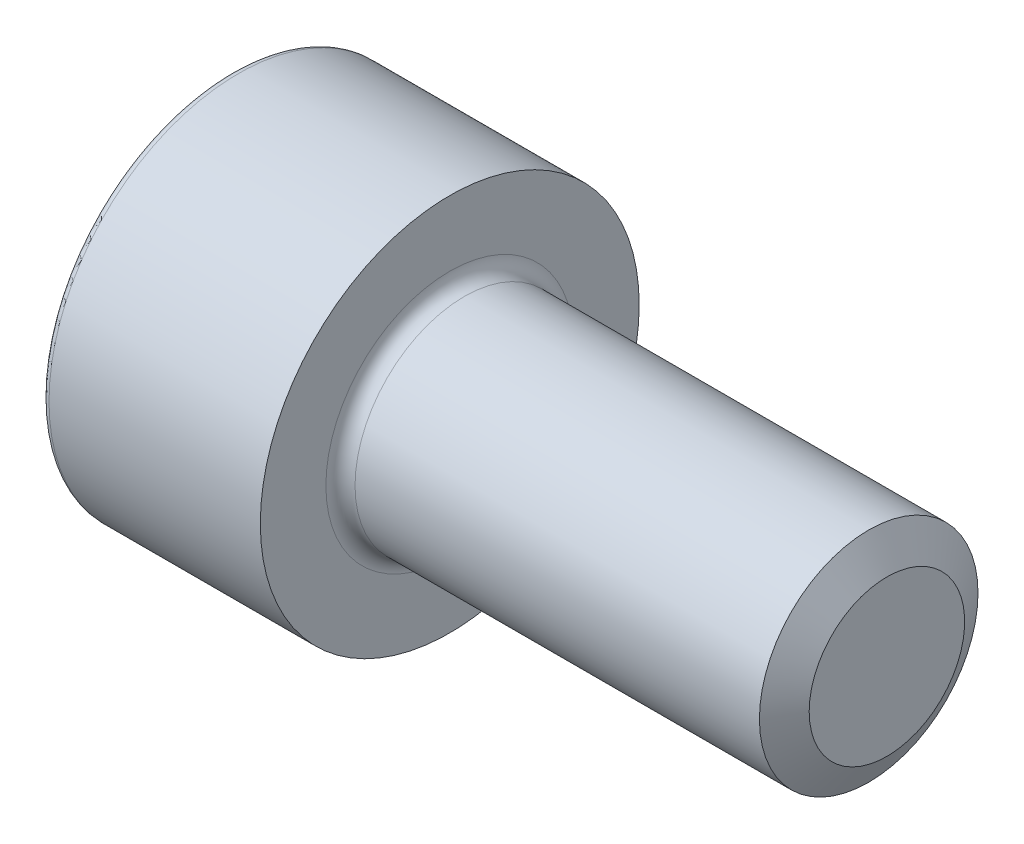
ISO-10303-21;
HEADER;
FILE_DESCRIPTION(('STEP AP214'),'2;1');
FILE_NAME('part.step','',(''),(''),'','','');
FILE_SCHEMA(('AUTOMOTIVE_DESIGN { 1 0 10303 214 1 1 1 1 }'));
ENDSEC;
DATA;
#1=APPLICATION_CONTEXT('core data for automotive mechanical design processes');
#2=APPLICATION_PROTOCOL_DEFINITION('international standard','automotive_design',2000,#1);
#3=PRODUCT_CONTEXT('',#1,'mechanical');
#4=PRODUCT('Part','Part','',(#3));
#5=PRODUCT_RELATED_PRODUCT_CATEGORY('part','',(#4));
#6=PRODUCT_DEFINITION_FORMATION('','',#4);
#7=PRODUCT_DEFINITION_CONTEXT('part definition',#1,'design');
#8=PRODUCT_DEFINITION('design','',#6,#7);
#9=PRODUCT_DEFINITION_SHAPE('','',#8);
#10=(LENGTH_UNIT() NAMED_UNIT(*) SI_UNIT(.MILLI.,.METRE.));
#11=(NAMED_UNIT(*) PLANE_ANGLE_UNIT() SI_UNIT($,.RADIAN.));
#12=(NAMED_UNIT(*) SI_UNIT($,.STERADIAN.) SOLID_ANGLE_UNIT());
#13=UNCERTAINTY_MEASURE_WITH_UNIT(LENGTH_MEASURE(1.E-05),#10,'distance_accuracy_value','');
#14=(GEOMETRIC_REPRESENTATION_CONTEXT(3) GLOBAL_UNCERTAINTY_ASSIGNED_CONTEXT((#13)) GLOBAL_UNIT_ASSIGNED_CONTEXT((#10,
#11,#12)) REPRESENTATION_CONTEXT('',''));
#15=CARTESIAN_POINT('',(0.,0.,0.));
#16=DIRECTION('',(0.,0.,1.));
#17=DIRECTION('',(1.,0.,0.));
#18=AXIS2_PLACEMENT_3D('',#15,#16,#17);
#19=CARTESIAN_POINT('',(0.,0.,0.));
#20=DIRECTION('',(-1.,0.,0.));
#21=DIRECTION('',(0.,0.,1.));
#22=AXIS2_PLACEMENT_3D('',#19,#20,#21);
#23=CYLINDRICAL_SURFACE('',#22,1.5);
#24=CARTESIAN_POINT('',(3.2,0.,0.));
#25=DIRECTION('',(-1.,0.,0.));
#26=DIRECTION('',(0.,0.,1.));
#27=AXIS2_PLACEMENT_3D('',#24,#25,#26);
#28=CIRCLE('',#27,1.5);
#29=CARTESIAN_POINT('',(3.2,0.,1.5));
#30=VERTEX_POINT('',#29);
#31=EDGE_CURVE('E158',#30,#30,#28,.T.);
#32=ORIENTED_EDGE('',*,*,#31,.F.);
#33=EDGE_LOOP('',(#32));
#34=FACE_BOUND('',#33,.T.);
#35=CARTESIAN_POINT('',(8.75000733344089,0.,0.));
#36=DIRECTION('',(-1.,0.,0.));
#37=DIRECTION('',(0.,0.,1.));
#38=AXIS2_PLACEMENT_3D('',#35,#36,#37);
#39=CIRCLE('',#38,1.5);
#40=CARTESIAN_POINT('',(8.75000733344089,0.,1.5));
#41=VERTEX_POINT('',#40);
#42=EDGE_CURVE('E295',#41,#41,#39,.T.);
#43=ORIENTED_EDGE('',*,*,#42,.T.);
#44=EDGE_LOOP('',(#43));
#45=FACE_BOUND('',#44,.T.);
#46=ADVANCED_FACE('F55',(#34,#45),#23,.T.);
#47=CARTESIAN_POINT('',(0.,0.,0.));
#48=DIRECTION('',(1.,0.,0.));
#49=DIRECTION('',(0.,0.,-1.));
#50=AXIS2_PLACEMENT_3D('',#47,#48,#49);
#51=PLANE('',#50);
#52=CARTESIAN_POINT('',(0.,0.,0.));
#53=DIRECTION('',(1.,0.,0.));
#54=DIRECTION('',(0.,0.,-1.));
#55=AXIS2_PLACEMENT_3D('',#52,#53,#54);
#56=CIRCLE('',#55,2.5);
#57=CARTESIAN_POINT('',(0.,0.,-2.5));
#58=VERTEX_POINT('',#57);
#59=EDGE_CURVE('E63',#58,#58,#56,.F.);
#60=ORIENTED_EDGE('',*,*,#59,.T.);
#61=EDGE_LOOP('',(#60));
#62=FACE_BOUND('',#61,.T.);
#63=DIRECTION('',(0.,0.866025403784439,-0.5));
#64=VECTOR('',#63,1.);
#65=CARTESIAN_POINT('',(0.,0.,1.435));
#66=LINE('',#65,#64);
#67=CARTESIAN_POINT('',(0.,0.,1.435));
#68=VERTEX_POINT('',#67);
#69=CARTESIAN_POINT('',(0.,1.24274645443067,0.717499999999999));
#70=VERTEX_POINT('',#69);
#71=EDGE_CURVE('E144',#68,#70,#66,.T.);
#72=ORIENTED_EDGE('',*,*,#71,.F.);
#73=DIRECTION('',(0.,0.866025403784439,0.5));
#74=VECTOR('',#73,1.);
#75=CARTESIAN_POINT('',(0.,-1.24274645443067,0.7175));
#76=LINE('',#75,#74);
#77=CARTESIAN_POINT('',(0.,-1.24274645443067,0.7175));
#78=VERTEX_POINT('',#77);
#79=EDGE_CURVE('E70',#78,#68,#76,.T.);
#80=ORIENTED_EDGE('',*,*,#79,.F.);
#81=DIRECTION('',(0.,0.,1.));
#82=VECTOR('',#81,1.);
#83=CARTESIAN_POINT('',(0.,-1.24274645443067,-0.7175));
#84=LINE('',#83,#82);
#85=CARTESIAN_POINT('',(0.,-1.24274645443067,-0.7175));
#86=VERTEX_POINT('',#85);
#87=EDGE_CURVE('E154',#86,#78,#84,.T.);
#88=ORIENTED_EDGE('',*,*,#87,.F.);
#89=DIRECTION('',(0.,-0.866025403784439,0.5));
#90=VECTOR('',#89,1.);
#91=CARTESIAN_POINT('',(0.,0.,-1.435));
#92=LINE('',#91,#90);
#93=CARTESIAN_POINT('',(0.,0.,-1.435));
#94=VERTEX_POINT('',#93);
#95=EDGE_CURVE('E152',#94,#86,#92,.T.);
#96=ORIENTED_EDGE('',*,*,#95,.F.);
#97=DIRECTION('',(0.,-0.866025403784439,-0.5));
#98=VECTOR('',#97,1.);
#99=CARTESIAN_POINT('',(0.,1.24274645443067,-0.7175));
#100=LINE('',#99,#98);
#101=CARTESIAN_POINT('',(0.,1.24274645443067,-0.7175));
#102=VERTEX_POINT('',#101);
#103=EDGE_CURVE('E118',#102,#94,#100,.T.);
#104=ORIENTED_EDGE('',*,*,#103,.F.);
#105=DIRECTION('',(0.,0.,-1.));
#106=VECTOR('',#105,1.);
#107=CARTESIAN_POINT('',(0.,1.24274645443067,0.717499999999999));
#108=LINE('',#107,#106);
#109=EDGE_CURVE('E148',#70,#102,#108,.T.);
#110=ORIENTED_EDGE('',*,*,#109,.F.);
#111=EDGE_LOOP('',(#72,#80,#88,#96,#104,#110));
#112=FACE_BOUND('',#111,.T.);
#113=ADVANCED_FACE('F175',(#62,#112),#51,.F.);
#114=CARTESIAN_POINT('',(0.,0.,0.));
#115=DIRECTION('',(-1.,0.,0.));
#116=DIRECTION('',(0.,0.,1.));
#117=AXIS2_PLACEMENT_3D('',#114,#115,#116);
#118=CYLINDRICAL_SURFACE('',#117,2.6);
#119=CARTESIAN_POINT('',(0.1,0.,0.));
#120=DIRECTION('',(1.,0.,0.));
#121=DIRECTION('',(0.,0.,-1.));
#122=AXIS2_PLACEMENT_3D('',#119,#120,#121);
#123=CIRCLE('',#122,2.6);
#124=CARTESIAN_POINT('',(0.1,0.,-2.6));
#125=VERTEX_POINT('',#124);
#126=EDGE_CURVE('E13',#125,#125,#123,.T.);
#127=ORIENTED_EDGE('',*,*,#126,.T.);
#128=EDGE_LOOP('',(#127));
#129=FACE_BOUND('',#128,.T.);
#130=CARTESIAN_POINT('',(3.,0.,0.));
#131=DIRECTION('',(-1.,0.,0.));
#132=DIRECTION('',(0.,0.,1.));
#133=AXIS2_PLACEMENT_3D('',#130,#131,#132);
#134=CIRCLE('',#133,2.6);
#135=CARTESIAN_POINT('',(3.,0.,2.6));
#136=VERTEX_POINT('',#135);
#137=EDGE_CURVE('E169',#136,#136,#134,.T.);
#138=ORIENTED_EDGE('',*,*,#137,.T.);
#139=EDGE_LOOP('',(#138));
#140=FACE_BOUND('',#139,.T.);
#141=ADVANCED_FACE('F194',(#129,#140),#118,.T.);
#142=CARTESIAN_POINT('',(3.,2.6,0.));
#143=DIRECTION('',(-1.,0.,0.));
#144=DIRECTION('',(0.,0.,1.));
#145=AXIS2_PLACEMENT_3D('',#142,#143,#144);
#146=PLANE('',#145);
#147=ORIENTED_EDGE('',*,*,#137,.F.);
#148=EDGE_LOOP('',(#147));
#149=FACE_BOUND('',#148,.T.);
#150=CARTESIAN_POINT('',(3.,0.,0.));
#151=DIRECTION('',(-1.,0.,0.));
#152=DIRECTION('',(0.,0.,1.));
#153=AXIS2_PLACEMENT_3D('',#150,#151,#152);
#154=CIRCLE('',#153,1.7);
#155=CARTESIAN_POINT('',(3.,0.,1.7));
#156=VERTEX_POINT('',#155);
#157=EDGE_CURVE('E166',#156,#156,#154,.T.);
#158=ORIENTED_EDGE('',*,*,#157,.T.);
#159=EDGE_LOOP('',(#158));
#160=FACE_BOUND('',#159,.T.);
#161=ADVANCED_FACE('F203',(#149,#160),#146,.F.);
#162=CARTESIAN_POINT('',(3.2,0.,0.));
#163=DIRECTION('',(-1.,0.,0.));
#164=DIRECTION('',(0.,0.,1.));
#165=AXIS2_PLACEMENT_3D('',#162,#163,#164);
#166=TOROIDAL_SURFACE('',#165,1.7,0.2);
#167=ORIENTED_EDGE('',*,*,#157,.F.);
#168=EDGE_LOOP('',(#167));
#169=FACE_BOUND('',#168,.T.);
#170=ORIENTED_EDGE('',*,*,#31,.T.);
#171=EDGE_LOOP('',(#170));
#172=FACE_BOUND('',#171,.T.);
#173=ADVANCED_FACE('F199',(#169,#172),#166,.F.);
#174=CARTESIAN_POINT('',(1.3,-1.24274645443067,0.7175));
#175=DIRECTION('',(0.,-0.5,0.866025403784439));
#176=DIRECTION('',(0.,-0.866025403784439,-0.5));
#177=AXIS2_PLACEMENT_3D('',#174,#175,#176);
#178=PLANE('',#177);
#179=ORIENTED_EDGE('',*,*,#79,.T.);
#180=DIRECTION('',(-1.,0.,0.));
#181=VECTOR('',#180,1.);
#182=CARTESIAN_POINT('',(1.3,0.,1.435));
#183=LINE('',#182,#181);
#184=CARTESIAN_POINT('',(1.3,0.,1.435));
#185=VERTEX_POINT('',#184);
#186=EDGE_CURVE('E100',#185,#68,#183,.T.);
#187=ORIENTED_EDGE('',*,*,#186,.F.);
#188=DIRECTION('',(0.,0.866025403784439,0.5));
#189=VECTOR('',#188,1.);
#190=CARTESIAN_POINT('',(1.3,-1.24274645443067,0.7175));
#191=LINE('',#190,#189);
#192=CARTESIAN_POINT('',(1.3,-1.24274645443067,0.7175));
#193=VERTEX_POINT('',#192);
#194=EDGE_CURVE('E156',#193,#185,#191,.T.);
#195=ORIENTED_EDGE('',*,*,#194,.F.);
#196=DIRECTION('',(-1.,0.,0.));
#197=VECTOR('',#196,1.);
#198=CARTESIAN_POINT('',(1.3,-1.24274645443067,0.7175));
#199=LINE('',#198,#197);
#200=EDGE_CURVE('E78',#193,#78,#199,.T.);
#201=ORIENTED_EDGE('',*,*,#200,.T.);
#202=EDGE_LOOP('',(#179,#187,#195,#201));
#203=FACE_BOUND('',#202,.T.);
#204=ADVANCED_FACE('F202',(#203),#178,.F.);
#205=CARTESIAN_POINT('',(1.3,-1.24274645443067,-0.7175));
#206=DIRECTION('',(0.,-1.,0.));
#207=DIRECTION('',(0.,0.,-1.));
#208=AXIS2_PLACEMENT_3D('',#205,#206,#207);
#209=PLANE('',#208);
#210=ORIENTED_EDGE('',*,*,#87,.T.);
#211=ORIENTED_EDGE('',*,*,#200,.F.);
#212=DIRECTION('',(0.,0.,1.));
#213=VECTOR('',#212,1.);
#214=CARTESIAN_POINT('',(1.3,-1.24274645443067,-0.7175));
#215=LINE('',#214,#213);
#216=CARTESIAN_POINT('',(1.3,-1.24274645443067,-0.7175));
#217=VERTEX_POINT('',#216);
#218=EDGE_CURVE('E130',#217,#193,#215,.T.);
#219=ORIENTED_EDGE('',*,*,#218,.F.);
#220=DIRECTION('',(-1.,0.,0.));
#221=VECTOR('',#220,1.);
#222=CARTESIAN_POINT('',(1.3,-1.24274645443067,-0.7175));
#223=LINE('',#222,#221);
#224=EDGE_CURVE('E122',#217,#86,#223,.T.);
#225=ORIENTED_EDGE('',*,*,#224,.T.);
#226=EDGE_LOOP('',(#210,#211,#219,#225));
#227=FACE_BOUND('',#226,.T.);
#228=ADVANCED_FACE('F233',(#227),#209,.F.);
#229=CARTESIAN_POINT('',(1.3,0.,-1.435));
#230=DIRECTION('',(0.,-0.5,-0.866025403784439));
#231=DIRECTION('',(0.,0.866025403784439,-0.5));
#232=AXIS2_PLACEMENT_3D('',#229,#230,#231);
#233=PLANE('',#232);
#234=ORIENTED_EDGE('',*,*,#95,.T.);
#235=ORIENTED_EDGE('',*,*,#224,.F.);
#236=DIRECTION('',(0.,-0.866025403784439,0.5));
#237=VECTOR('',#236,1.);
#238=CARTESIAN_POINT('',(1.3,0.,-1.435));
#239=LINE('',#238,#237);
#240=CARTESIAN_POINT('',(1.3,0.,-1.435));
#241=VERTEX_POINT('',#240);
#242=EDGE_CURVE('E126',#241,#217,#239,.T.);
#243=ORIENTED_EDGE('',*,*,#242,.F.);
#244=DIRECTION('',(-1.,0.,0.));
#245=VECTOR('',#244,1.);
#246=CARTESIAN_POINT('',(1.3,0.,-1.435));
#247=LINE('',#246,#245);
#248=EDGE_CURVE('E111',#241,#94,#247,.T.);
#249=ORIENTED_EDGE('',*,*,#248,.T.);
#250=EDGE_LOOP('',(#234,#235,#243,#249));
#251=FACE_BOUND('',#250,.T.);
#252=ADVANCED_FACE('F127',(#251),#233,.F.);
#253=CARTESIAN_POINT('',(1.3,1.24274645443067,-0.7175));
#254=DIRECTION('',(0.,0.5,-0.866025403784439));
#255=DIRECTION('',(0.,0.866025403784439,0.5));
#256=AXIS2_PLACEMENT_3D('',#253,#254,#255);
#257=PLANE('',#256);
#258=ORIENTED_EDGE('',*,*,#103,.T.);
#259=ORIENTED_EDGE('',*,*,#248,.F.);
#260=DIRECTION('',(0.,-0.866025403784439,-0.5));
#261=VECTOR('',#260,1.);
#262=CARTESIAN_POINT('',(1.3,1.24274645443067,-0.7175));
#263=LINE('',#262,#261);
#264=CARTESIAN_POINT('',(1.3,1.24274645443067,-0.7175));
#265=VERTEX_POINT('',#264);
#266=EDGE_CURVE('E115',#265,#241,#263,.T.);
#267=ORIENTED_EDGE('',*,*,#266,.F.);
#268=DIRECTION('',(-1.,0.,0.));
#269=VECTOR('',#268,1.);
#270=CARTESIAN_POINT('',(1.3,1.24274645443067,-0.7175));
#271=LINE('',#270,#269);
#272=EDGE_CURVE('E123',#265,#102,#271,.T.);
#273=ORIENTED_EDGE('',*,*,#272,.T.);
#274=EDGE_LOOP('',(#258,#259,#267,#273));
#275=FACE_BOUND('',#274,.T.);
#276=ADVANCED_FACE('F113',(#275),#257,.F.);
#277=CARTESIAN_POINT('',(1.3,1.24274645443067,0.717499999999999));
#278=DIRECTION('',(0.,1.,0.));
#279=DIRECTION('',(0.,0.,1.));
#280=AXIS2_PLACEMENT_3D('',#277,#278,#279);
#281=PLANE('',#280);
#282=ORIENTED_EDGE('',*,*,#109,.T.);
#283=ORIENTED_EDGE('',*,*,#272,.F.);
#284=DIRECTION('',(0.,0.,-1.));
#285=VECTOR('',#284,1.);
#286=CARTESIAN_POINT('',(1.3,1.24274645443067,0.717499999999999));
#287=LINE('',#286,#285);
#288=CARTESIAN_POINT('',(1.3,1.24274645443067,0.717499999999999));
#289=VERTEX_POINT('',#288);
#290=EDGE_CURVE('E136',#289,#265,#287,.T.);
#291=ORIENTED_EDGE('',*,*,#290,.F.);
#292=DIRECTION('',(-1.,0.,0.));
#293=VECTOR('',#292,1.);
#294=CARTESIAN_POINT('',(1.3,1.24274645443067,0.717499999999999));
#295=LINE('',#294,#293);
#296=EDGE_CURVE('E161',#289,#70,#295,.T.);
#297=ORIENTED_EDGE('',*,*,#296,.T.);
#298=EDGE_LOOP('',(#282,#283,#291,#297));
#299=FACE_BOUND('',#298,.T.);
#300=ADVANCED_FACE('F251',(#299),#281,.F.);
#301=CARTESIAN_POINT('',(1.3,0.,1.435));
#302=DIRECTION('',(0.,0.5,0.866025403784439));
#303=DIRECTION('',(0.,-0.866025403784439,0.5));
#304=AXIS2_PLACEMENT_3D('',#301,#302,#303);
#305=PLANE('',#304);
#306=ORIENTED_EDGE('',*,*,#71,.T.);
#307=ORIENTED_EDGE('',*,*,#296,.F.);
#308=DIRECTION('',(0.,0.866025403784439,-0.5));
#309=VECTOR('',#308,1.);
#310=CARTESIAN_POINT('',(1.3,0.,1.435));
#311=LINE('',#310,#309);
#312=EDGE_CURVE('E138',#185,#289,#311,.T.);
#313=ORIENTED_EDGE('',*,*,#312,.F.);
#314=ORIENTED_EDGE('',*,*,#186,.T.);
#315=EDGE_LOOP('',(#306,#307,#313,#314));
#316=FACE_BOUND('',#315,.T.);
#317=ADVANCED_FACE('F258',(#316),#305,.F.);
#318=CARTESIAN_POINT('',(1.3,-1.24274645443067,0.7175));
#319=DIRECTION('',(1.,0.,0.));
#320=DIRECTION('',(0.,0.,-1.));
#321=AXIS2_PLACEMENT_3D('',#318,#319,#320);
#322=PLANE('',#321);
#323=ORIENTED_EDGE('',*,*,#194,.T.);
#324=ORIENTED_EDGE('',*,*,#312,.T.);
#325=ORIENTED_EDGE('',*,*,#290,.T.);
#326=ORIENTED_EDGE('',*,*,#266,.T.);
#327=ORIENTED_EDGE('',*,*,#242,.T.);
#328=ORIENTED_EDGE('',*,*,#218,.T.);
#329=EDGE_LOOP('',(#323,#324,#325,#326,#327,#328));
#330=FACE_BOUND('',#329,.T.);
#331=ADVANCED_FACE('F133',(#330),#322,.F.);
#332=CARTESIAN_POINT('',(8.75000733344089,0.,0.));
#333=DIRECTION('',(-1.,0.,0.));
#334=DIRECTION('',(0.,0.,1.));
#335=AXIS2_PLACEMENT_3D('',#332,#333,#334);
#336=CONICAL_SURFACE('',#335,1.5,1.04719755119659);
#337=CARTESIAN_POINT('',(9.,0.,0.));
#338=DIRECTION('',(-1.,0.,0.));
#339=DIRECTION('',(0.,0.,1.));
#340=AXIS2_PLACEMENT_3D('',#337,#338,#339);
#341=CIRCLE('',#340,1.067);
#342=CARTESIAN_POINT('',(9.,0.,1.067));
#343=VERTEX_POINT('',#342);
#344=EDGE_CURVE('E145',#343,#343,#341,.T.);
#345=ORIENTED_EDGE('',*,*,#344,.T.);
#346=EDGE_LOOP('',(#345));
#347=FACE_BOUND('',#346,.T.);
#348=ORIENTED_EDGE('',*,*,#42,.F.);
#349=EDGE_LOOP('',(#348));
#350=FACE_BOUND('',#349,.T.);
#351=ADVANCED_FACE('F184',(#347,#350),#336,.T.);
#352=CARTESIAN_POINT('',(9.,1.5,0.));
#353=DIRECTION('',(-1.,0.,0.));
#354=DIRECTION('',(0.,0.,1.));
#355=AXIS2_PLACEMENT_3D('',#352,#353,#354);
#356=PLANE('',#355);
#357=ORIENTED_EDGE('',*,*,#344,.F.);
#358=EDGE_LOOP('',(#357));
#359=FACE_BOUND('',#358,.T.);
#360=ADVANCED_FACE('F179',(#359),#356,.F.);
#361=CARTESIAN_POINT('',(0.1,0.,0.));
#362=DIRECTION('',(1.,0.,0.));
#363=DIRECTION('',(0.,0.,-1.));
#364=AXIS2_PLACEMENT_3D('',#361,#362,#363);
#365=TOROIDAL_SURFACE('',#364,2.5,0.1);
#366=ORIENTED_EDGE('',*,*,#126,.F.);
#367=EDGE_LOOP('',(#366));
#368=FACE_BOUND('',#367,.T.);
#369=ORIENTED_EDGE('',*,*,#59,.F.);
#370=EDGE_LOOP('',(#369));
#371=FACE_BOUND('',#370,.T.);
#372=ADVANCED_FACE('F57',(#368,#371),#365,.T.);
#373=CLOSED_SHELL('',(#46,#113,#141,#161,#173,#204,#228,#252,#276,#300,#317,#331,#351,#360,#372));
#374=MANIFOLD_SOLID_BREP('B2',#373);
#375=ADVANCED_BREP_SHAPE_REPRESENTATION('',(#18,#374),#14);
#376=SHAPE_DEFINITION_REPRESENTATION(#9,#375);
ENDSEC;
END-ISO-10303-21;
